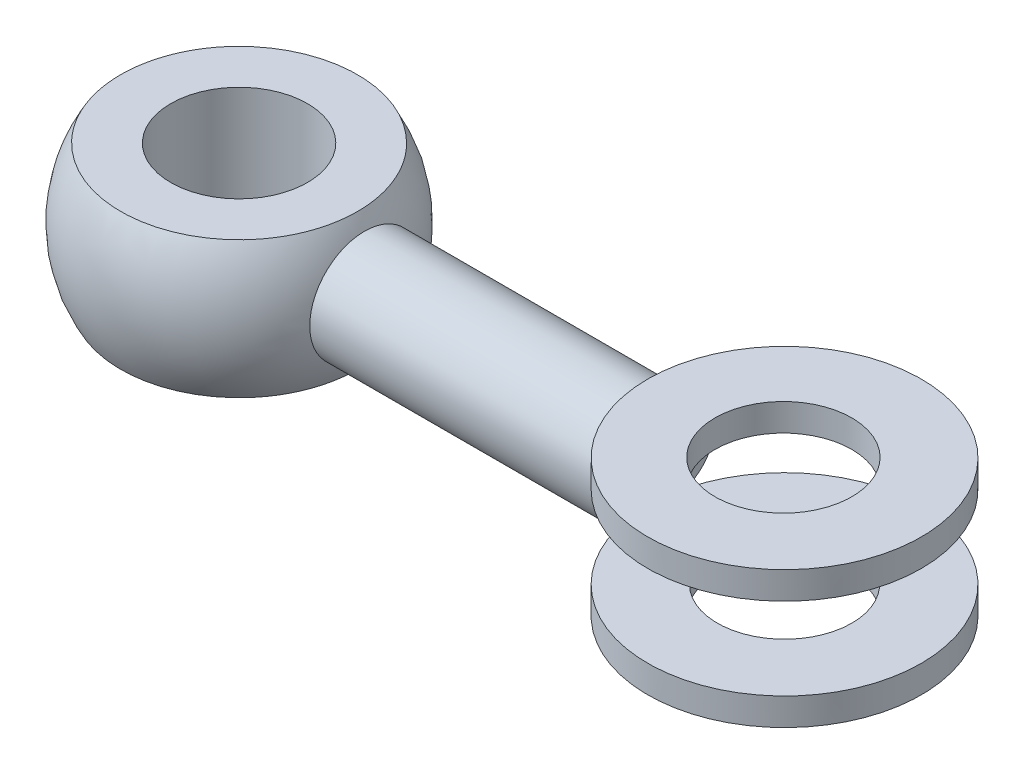
ISO-10303-21;
HEADER;
FILE_DESCRIPTION(('STEP AP214'),'2;1');
FILE_NAME('part.step','',(''),(''),'','','');
FILE_SCHEMA(('AUTOMOTIVE_DESIGN { 1 0 10303 214 1 1 1 1 }'));
ENDSEC;
DATA;
#1=APPLICATION_CONTEXT('core data for automotive mechanical design processes');
#2=APPLICATION_PROTOCOL_DEFINITION('international standard','automotive_design',2000,#1);
#3=PRODUCT_CONTEXT('',#1,'mechanical');
#4=PRODUCT('Part','Part','',(#3));
#5=PRODUCT_RELATED_PRODUCT_CATEGORY('part','',(#4));
#6=PRODUCT_DEFINITION_FORMATION('','',#4);
#7=PRODUCT_DEFINITION_CONTEXT('part definition',#1,'design');
#8=PRODUCT_DEFINITION('design','',#6,#7);
#9=PRODUCT_DEFINITION_SHAPE('','',#8);
#10=(LENGTH_UNIT() NAMED_UNIT(*) SI_UNIT(.MILLI.,.METRE.));
#11=(NAMED_UNIT(*) PLANE_ANGLE_UNIT() SI_UNIT($,.RADIAN.));
#12=(NAMED_UNIT(*) SI_UNIT($,.STERADIAN.) SOLID_ANGLE_UNIT());
#13=UNCERTAINTY_MEASURE_WITH_UNIT(LENGTH_MEASURE(1.E-05),#10,'distance_accuracy_value','');
#14=(GEOMETRIC_REPRESENTATION_CONTEXT(3) GLOBAL_UNCERTAINTY_ASSIGNED_CONTEXT((#13)) GLOBAL_UNIT_ASSIGNED_CONTEXT((#10,
#11,#12)) REPRESENTATION_CONTEXT('',''));
#15=CARTESIAN_POINT('',(0.,0.,0.));
#16=DIRECTION('',(0.,0.,1.));
#17=DIRECTION('',(1.,0.,0.));
#18=AXIS2_PLACEMENT_3D('',#15,#16,#17);
#19=CARTESIAN_POINT('',(6.42740739472541,-2.5,0.));
#20=DIRECTION('',(0.,1.,0.));
#21=DIRECTION('',(-1.,0.,0.));
#22=AXIS2_PLACEMENT_3D('',#19,#20,#21);
#23=CYLINDRICAL_SURFACE('',#22,5.);
#24=CARTESIAN_POINT('',(6.42740739472541,2.5,0.));
#25=DIRECTION('',(0.,1.,0.));
#26=DIRECTION('',(-1.,0.,0.));
#27=AXIS2_PLACEMENT_3D('',#24,#25,#26);
#28=CIRCLE('',#27,5.);
#29=CARTESIAN_POINT('',(1.42740739472541,2.5,0.));
#30=VERTEX_POINT('',#29);
#31=EDGE_CURVE('E243',#30,#30,#28,.T.);
#32=ORIENTED_EDGE('',*,*,#31,.F.);
#33=EDGE_LOOP('',(#32));
#34=FACE_BOUND('',#33,.T.);
#35=CARTESIAN_POINT('',(6.42740739472541,1.5,0.));
#36=DIRECTION('',(0.,-1.,0.));
#37=DIRECTION('',(0.,0.,-1.));
#38=AXIS2_PLACEMENT_3D('',#35,#36,#37);
#39=CIRCLE('',#38,5.);
#40=CARTESIAN_POINT('',(1.60558201422893,1.5,1.32287565553229));
#41=VERTEX_POINT('',#40);
#42=CARTESIAN_POINT('',(1.60558201422893,1.5,-1.32287565553229));
#43=VERTEX_POINT('',#42);
#44=EDGE_CURVE('E98',#41,#43,#39,.F.);
#45=ORIENTED_EDGE('',*,*,#44,.T.);
#46=CARTESIAN_POINT('',(1.83288122185886,0.331165748765926,-1.97239175795386));
#47=CARTESIAN_POINT('',(1.82893263750543,0.386036592019982,-1.96318050221269));
#48=CARTESIAN_POINT('',(1.82402758674765,0.440420842367134,-1.95169241890632));
#49=CARTESIAN_POINT('',(1.81250739932647,0.547851658409661,-1.92430003005419));
#50=CARTESIAN_POINT('',(1.80589314334185,0.600898897604836,-1.90839799851121));
#51=CARTESIAN_POINT('',(1.78384202757039,0.757153398625582,-1.8544041089398));
#52=CARTESIAN_POINT('',(1.7661618452424,0.85791945597766,-1.80994823163201));
#53=CARTESIAN_POINT('',(1.72701358170304,1.05003532469302,-1.70568947825292));
#54=CARTESIAN_POINT('',(1.70555139849076,1.14139945190011,-1.64591043348496));
#55=CARTESIAN_POINT('',(1.66113783118858,1.31309165847897,-1.51248684860598));
#56=CARTESIAN_POINT('',(1.63818510217293,1.39340956124502,-1.43882966900037));
#57=CARTESIAN_POINT('',(1.59204286622503,1.54473339498981,-1.27545539668637));
#58=CARTESIAN_POINT('',(1.56889548140472,1.6151020789403,-1.18513438875745));
#59=CARTESIAN_POINT('',(1.52606650325707,1.7397044381672,-0.99323041930822));
#60=CARTESIAN_POINT('',(1.5063841418371,1.79394169114457,-0.891649961829483));
#61=CARTESIAN_POINT('',(1.47292268957639,1.88378282495693,-0.68135518704803));
#62=CARTESIAN_POINT('',(1.45906398703749,1.91963957651882,-0.572762192378152));
#63=CARTESIAN_POINT('',(1.43845566840791,1.97236843623797,-0.350424487117826));
#64=CARTESIAN_POINT('',(1.4317024232724,1.98925023597262,-0.236682437351122));
#65=CARTESIAN_POINT('',(1.42628804134501,2.00280408481383,-0.0154271565858854));
#66=CARTESIAN_POINT('',(1.42711892832258,2.00074471651273,0.0919976467370722));
#67=CARTESIAN_POINT('',(1.43557369588906,1.97951976775636,0.30485829153367));
#68=CARTESIAN_POINT('',(1.44319702182715,1.9603555840304,0.410294294689108));
#69=CARTESIAN_POINT('',(1.46423624321423,1.9062190869795,0.614207606001767));
#70=CARTESIAN_POINT('',(1.47753886030253,1.87155531746428,0.712779293240618));
#71=CARTESIAN_POINT('',(1.50863571674775,1.78768772417269,0.902751692114103));
#72=CARTESIAN_POINT('',(1.5264307925382,1.73848119244411,0.994151064204514));
#73=CARTESIAN_POINT('',(1.56589726051175,1.62398137723342,1.17238413674218));
#74=CARTESIAN_POINT('',(1.58772266128589,1.55798161169196,1.25872938560521));
#75=CARTESIAN_POINT('',(1.63242062648975,1.41302746282852,1.41953592797625));
#76=CARTESIAN_POINT('',(1.6552939415832,1.33406368484425,1.4939885254366));
#77=CARTESIAN_POINT('',(1.70105395501131,1.16010845766205,1.63317372086297));
#78=CARTESIAN_POINT('',(1.72386738057451,1.06446074390196,1.69711234708075));
#79=CARTESIAN_POINT('',(1.76531275420334,0.863002021029599,1.80786802969631));
#80=CARTESIAN_POINT('',(1.78395219978249,0.757209730521084,1.85471588223527));
#81=CARTESIAN_POINT('',(1.806465622332,0.596416555827244,1.90977862896632));
#82=CARTESIAN_POINT('',(1.81293136369684,0.544190083309624,1.92531359443896));
#83=CARTESIAN_POINT('',(1.82419821994782,0.438520729472062,1.95209268603528));
#84=CARTESIAN_POINT('',(1.82900071014408,0.385078892272526,1.96334035801679));
#85=CARTESIAN_POINT('',(1.83288122185886,0.331165748765926,1.97239175795386));
#86=B_SPLINE_CURVE_WITH_KNOTS('',3,(#46,#47,#48,#49,#50,#51,#52,#53,#54,#55,#56,#57,#58,#59,#60,
#61,#62,#63,#64,#65,#66,#67,#68,#69,#70,#71,#72,#73,#74,#75,#76,#77,#78,#79,#80,#81,#82,#83,#84,
#85),.UNSPECIFIED.,.F.,.F.,(4,2,2,2,2,2,2,2,2,2,2,2,2,2,2,2,2,2,2,4),(0.,0.167214792314317,
0.334343597350645,0.66725831675205,0.999658380343221,1.33236265317764,1.6811386074451,
2.02983715084009,2.37360022246492,2.71718763501425,3.0379400690038,3.35866631368158,
3.67327410910755,3.9879405233981,4.31905648687453,4.65041346876553,5.00062202736801,
5.35019638565966,5.51462860323809,5.67892452854978),.UNSPECIFIED.);
#87=EDGE_CURVE('E182',#43,#41,#86,.T.);
#88=ORIENTED_EDGE('',*,*,#87,.T.);
#89=EDGE_LOOP('',(#45,#88));
#90=FACE_BOUND('',#89,.T.);
#91=ADVANCED_FACE('F46',(#34,#90),#23,.T.);
#92=CARTESIAN_POINT('',(6.38514994154831,-2.5,0.));
#93=DIRECTION('',(0.,1.,0.));
#94=DIRECTION('',(-1.,0.,0.));
#95=AXIS2_PLACEMENT_3D('',#92,#93,#94);
#96=CYLINDRICAL_SURFACE('',#95,2.5);
#97=CARTESIAN_POINT('',(6.38514994154831,1.5,0.));
#98=DIRECTION('',(0.,-1.,0.));
#99=DIRECTION('',(0.,0.,-1.));
#100=AXIS2_PLACEMENT_3D('',#97,#98,#99);
#101=CIRCLE('',#100,2.5);
#102=CARTESIAN_POINT('',(6.38514994154831,1.5,-2.5));
#103=VERTEX_POINT('',#102);
#104=EDGE_CURVE('E123',#103,#103,#101,.F.);
#105=ORIENTED_EDGE('',*,*,#104,.F.);
#106=EDGE_LOOP('',(#105));
#107=FACE_BOUND('',#106,.T.);
#108=CARTESIAN_POINT('',(6.3851499415483,2.5,0.));
#109=DIRECTION('',(0.,1.,0.));
#110=DIRECTION('',(-1.,0.,0.));
#111=AXIS2_PLACEMENT_3D('',#108,#109,#110);
#112=CIRCLE('',#111,2.5);
#113=CARTESIAN_POINT('',(3.8851499415483,2.5,0.));
#114=VERTEX_POINT('',#113);
#115=EDGE_CURVE('E245',#114,#114,#112,.T.);
#116=ORIENTED_EDGE('',*,*,#115,.T.);
#117=EDGE_LOOP('',(#116));
#118=FACE_BOUND('',#117,.T.);
#119=ADVANCED_FACE('F158',(#107,#118),#96,.F.);
#120=CARTESIAN_POINT('',(-13.5102645286488,0.,0.));
#121=DIRECTION('',(1.,0.,0.));
#122=DIRECTION('',(0.,1.,0.));
#123=AXIS2_PLACEMENT_3D('',#120,#121,#122);
#124=SPHERICAL_SURFACE('',#123,5.);
#125=CARTESIAN_POINT('',(-13.5102645286488,-2.5,0.));
#126=DIRECTION('',(0.,1.,0.));
#127=DIRECTION('',(-1.,0.,0.));
#128=AXIS2_PLACEMENT_3D('',#125,#126,#127);
#129=CIRCLE('',#128,4.33012701892219);
#130=CARTESIAN_POINT('',(-17.840391547571,-2.5,0.));
#131=VERTEX_POINT('',#130);
#132=EDGE_CURVE('E56',#131,#131,#129,.F.);
#133=ORIENTED_EDGE('',*,*,#132,.F.);
#134=EDGE_LOOP('',(#133));
#135=FACE_BOUND('',#134,.T.);
#136=CARTESIAN_POINT('',(-8.92768883369292,0.,0.));
#137=DIRECTION('',(1.,0.,0.));
#138=DIRECTION('',(0.,1.,0.));
#139=AXIS2_PLACEMENT_3D('',#136,#137,#138);
#140=CIRCLE('',#139,2.);
#141=CARTESIAN_POINT('',(-8.92768883369292,2.,0.));
#142=VERTEX_POINT('',#141);
#143=EDGE_CURVE('E206',#142,#142,#140,.T.);
#144=ORIENTED_EDGE('',*,*,#143,.F.);
#145=EDGE_LOOP('',(#144));
#146=FACE_BOUND('',#145,.T.);
#147=CARTESIAN_POINT('',(-13.5102645286488,2.5,0.));
#148=DIRECTION('',(0.,1.,0.));
#149=DIRECTION('',(-1.,0.,0.));
#150=AXIS2_PLACEMENT_3D('',#147,#148,#149);
#151=CIRCLE('',#150,4.33012701892219);
#152=CARTESIAN_POINT('',(-17.840391547571,2.5,0.));
#153=VERTEX_POINT('',#152);
#154=EDGE_CURVE('E12',#153,#153,#151,.F.);
#155=ORIENTED_EDGE('',*,*,#154,.T.);
#156=EDGE_LOOP('',(#155));
#157=FACE_BOUND('',#156,.T.);
#158=ADVANCED_FACE('F48',(#135,#146,#157),#124,.T.);
#159=CARTESIAN_POINT('',(13.4897354713512,0.,0.));
#160=DIRECTION('',(1.,0.,0.));
#161=DIRECTION('',(0.,1.,0.));
#162=AXIS2_PLACEMENT_3D('',#159,#160,#161);
#163=CYLINDRICAL_SURFACE('',#162,2.);
#164=DIRECTION('',(1.,0.,0.));
#165=VECTOR('',#164,1.);
#166=CARTESIAN_POINT('',(13.4897354713512,-1.5,-1.3228756555323));
#167=LINE('',#166,#165);
#168=CARTESIAN_POINT('',(1.60558201422893,-1.5,-1.3228756555323));
#169=VERTEX_POINT('',#168);
#170=CARTESIAN_POINT('',(1.56332456105183,-1.5,-1.3228756555323));
#171=VERTEX_POINT('',#170);
#172=EDGE_CURVE('E128',#169,#171,#167,.F.);
#173=ORIENTED_EDGE('',*,*,#172,.F.);
#174=CARTESIAN_POINT('',(1.83288122185886,-0.331165748765929,1.97239175795386));
#175=CARTESIAN_POINT('',(1.82893263750543,-0.386036592019986,1.96318050221269));
#176=CARTESIAN_POINT('',(1.82402758674765,-0.440420842367138,1.95169241890632));
#177=CARTESIAN_POINT('',(1.81250739932646,-0.547851658409665,1.92430003005419));
#178=CARTESIAN_POINT('',(1.80589314334185,-0.600898897604839,1.90839799851121));
#179=CARTESIAN_POINT('',(1.78384202757039,-0.757153398625586,1.8544041089398));
#180=CARTESIAN_POINT('',(1.7661618452424,-0.857919455977663,1.80994823163201));
#181=CARTESIAN_POINT('',(1.72701358170304,-1.05003532469302,1.70568947825292));
#182=CARTESIAN_POINT('',(1.70555139849076,-1.14139945190012,1.64591043348496));
#183=CARTESIAN_POINT('',(1.66113783118858,-1.31309165847897,1.51248684860598));
#184=CARTESIAN_POINT('',(1.63818510217293,-1.39340956124502,1.43882966900037));
#185=CARTESIAN_POINT('',(1.59204286622502,-1.54473339498982,1.27545539668637));
#186=CARTESIAN_POINT('',(1.56889548140472,-1.6151020789403,1.18513438875745));
#187=CARTESIAN_POINT('',(1.52606650325707,-1.7397044381672,0.99323041930822));
#188=CARTESIAN_POINT('',(1.5063841418371,-1.79394169114458,0.891649961829483));
#189=CARTESIAN_POINT('',(1.47292268957639,-1.88378282495694,0.681355187048029));
#190=CARTESIAN_POINT('',(1.45906398703749,-1.91963957651882,0.572762192378151));
#191=CARTESIAN_POINT('',(1.43845566840791,-1.97236843623797,0.350424487117826));
#192=CARTESIAN_POINT('',(1.4317024232724,-1.98925023597262,0.236682437351122));
#193=CARTESIAN_POINT('',(1.42628804134501,-2.00280408481384,0.0154271565858854));
#194=CARTESIAN_POINT('',(1.42711892832258,-2.00074471651274,-0.0919976467370722));
#195=CARTESIAN_POINT('',(1.43557369588906,-1.97951976775637,-0.30485829153367));
#196=CARTESIAN_POINT('',(1.44319702182715,-1.96035558403041,-0.410294294689108));
#197=CARTESIAN_POINT('',(1.46423624321423,-1.9062190869795,-0.614207606001767));
#198=CARTESIAN_POINT('',(1.47753886030253,-1.87155531746429,-0.712779293240618));
#199=CARTESIAN_POINT('',(1.50863571674775,-1.78768772417269,-0.902751692114104));
#200=CARTESIAN_POINT('',(1.5264307925382,-1.73848119244411,-0.994151064204514));
#201=CARTESIAN_POINT('',(1.56589726051175,-1.62398137723343,-1.17238413674218));
#202=CARTESIAN_POINT('',(1.58772266128589,-1.55798161169196,-1.25872938560521));
#203=CARTESIAN_POINT('',(1.63242062648975,-1.41302746282852,-1.41953592797625));
#204=CARTESIAN_POINT('',(1.6552939415832,-1.33406368484425,-1.4939885254366));
#205=CARTESIAN_POINT('',(1.70105395501131,-1.16010845766205,-1.63317372086297));
#206=CARTESIAN_POINT('',(1.72386738057451,-1.06446074390197,-1.69711234708075));
#207=CARTESIAN_POINT('',(1.76531275420334,-0.863002021029603,-1.80786802969631));
#208=CARTESIAN_POINT('',(1.78395219978249,-0.757209730521088,-1.85471588223527));
#209=CARTESIAN_POINT('',(1.806465622332,-0.596416555827247,-1.90977862896632));
#210=CARTESIAN_POINT('',(1.81293136369684,-0.544190083309628,-1.92531359443896));
#211=CARTESIAN_POINT('',(1.82419821994782,-0.438520729472065,-1.95209268603528));
#212=CARTESIAN_POINT('',(1.82900071014408,-0.38507889227253,-1.96334035801679));
#213=CARTESIAN_POINT('',(1.83288122185886,-0.331165748765929,-1.97239175795386));
#214=B_SPLINE_CURVE_WITH_KNOTS('',3,(#174,#175,#176,#177,#178,#179,#180,#181,#182,#183,#184,
#185,#186,#187,#188,#189,#190,#191,#192,#193,#194,#195,#196,#197,#198,#199,#200,#201,#202,#203,
#204,#205,#206,#207,#208,#209,#210,#211,#212,#213),.UNSPECIFIED.,.F.,.F.,(4,2,2,2,2,2,2,2,2,2,2,
2,2,2,2,2,2,2,2,4),(0.,0.167214792314317,0.334343597350645,0.66725831675205,0.999658380343221,
1.33236265317764,1.6811386074451,2.02983715084009,2.37360022246492,2.71718763501425,
3.0379400690038,3.35866631368158,3.67327410910755,3.9879405233981,4.31905648687453,
4.65041346876553,5.00062202736801,5.35019638565966,5.51462860323809,5.67892452854978),.UNSPECIFIED.);
#215=CARTESIAN_POINT('',(1.60558201422893,-1.5,1.3228756555323));
#216=VERTEX_POINT('',#215);
#217=EDGE_CURVE('E175',#216,#169,#214,.T.);
#218=ORIENTED_EDGE('',*,*,#217,.F.);
#219=DIRECTION('',(1.,0.,0.));
#220=VECTOR('',#219,1.);
#221=CARTESIAN_POINT('',(13.4897354713512,-1.5,1.3228756555323));
#222=LINE('',#221,#220);
#223=CARTESIAN_POINT('',(1.56332456105183,-1.5,1.3228756555323));
#224=VERTEX_POINT('',#223);
#225=EDGE_CURVE('E121',#224,#216,#222,.T.);
#226=ORIENTED_EDGE('',*,*,#225,.F.);
#227=CARTESIAN_POINT('',(1.56332456105183,-1.5,1.3228756555323));
#228=CARTESIAN_POINT('',(1.58644702610138,-1.42568406397232,1.4071992684898));
#229=CARTESIAN_POINT('',(1.61022096771197,-1.34427666934854,1.48512549597574));
#230=CARTESIAN_POINT('',(1.65654808267839,-1.1691071528308,1.62661061853871));
#231=CARTESIAN_POINT('',(1.67909754145861,-1.0753101107824,1.6901274721877));
#232=CARTESIAN_POINT('',(1.7203229573375,-0.877477742277934,1.80080644952772));
#233=CARTESIAN_POINT('',(1.73899242872696,-0.773425694930752,1.84794127636311));
#234=CARTESIAN_POINT('',(1.76993978236564,-0.558088970799774,1.92393740467447));
#235=CARTESIAN_POINT('',(1.78222813073349,-0.446816476220015,1.95282864563438));
#236=CARTESIAN_POINT('',(1.79825205619268,-0.226101882351161,1.9901669802762));
#237=CARTESIAN_POINT('',(1.8023888211344,-0.116851908196758,1.99957428871509));
#238=CARTESIAN_POINT('',(1.80274721370447,0.101740137298234,2.00039716549716));
#239=CARTESIAN_POINT('',(1.79896893102049,0.211082207581222,1.99181293770755));
#240=CARTESIAN_POINT('',(1.78443933234535,0.420588169738601,1.95800038379566));
#241=CARTESIAN_POINT('',(1.77407273920587,0.52092983746191,1.93368911347572));
#242=CARTESIAN_POINT('',(1.74797066484869,0.716102062040798,1.87022362030885));
#243=CARTESIAN_POINT('',(1.73223189318909,0.810929199504625,1.83106029899273));
#244=CARTESIAN_POINT('',(1.69629580775911,0.997032311509225,1.73703399951388));
#245=CARTESIAN_POINT('',(1.67593017387527,1.08795821646808,1.68154561607248));
#246=CARTESIAN_POINT('',(1.63337225451148,1.25948141121314,1.5572083507869));
#247=CARTESIAN_POINT('',(1.61118296002937,1.34009508005505,1.48838110385044));
#248=CARTESIAN_POINT('',(1.58050041509472,1.444105810342,1.384301739773));
#249=CARTESIAN_POINT('',(1.57186635099369,1.47254034587891,1.3540177578316));
#250=CARTESIAN_POINT('',(1.56332456105183,1.5,1.3228756555323));
#251=B_SPLINE_CURVE_WITH_KNOTS('',3,(#227,#228,#229,#230,#231,#232,#233,#234,#235,#236,#237,
#238,#239,#240,#241,#242,#243,#244,#245,#246,#247,#248,#249,#250),.UNSPECIFIED.,.F.,.F.,(4,2,2,
2,2,2,2,2,2,2,2,4),(0.,0.343917595759249,0.68882607250092,1.03430653466844,1.37921854642271,
1.70668366253024,2.03414506805748,2.34404950873948,2.65414410651059,2.97814781014448,
3.30163033030913,3.42883076671858),.UNSPECIFIED.);
#252=CARTESIAN_POINT('',(1.56332456105183,1.5,1.32287565553229));
#253=VERTEX_POINT('',#252);
#254=EDGE_CURVE('E109',#224,#253,#251,.T.);
#255=ORIENTED_EDGE('',*,*,#254,.T.);
#256=DIRECTION('',(1.,0.,0.));
#257=VECTOR('',#256,1.);
#258=CARTESIAN_POINT('',(13.4897354713512,1.5,1.32287565553229));
#259=LINE('',#258,#257);
#260=EDGE_CURVE('E91',#253,#41,#259,.T.);
#261=ORIENTED_EDGE('',*,*,#260,.T.);
#262=ORIENTED_EDGE('',*,*,#87,.F.);
#263=DIRECTION('',(1.,0.,0.));
#264=VECTOR('',#263,1.);
#265=CARTESIAN_POINT('',(13.4897354713512,1.5,-1.32287565553229));
#266=LINE('',#265,#264);
#267=CARTESIAN_POINT('',(1.56332456105183,1.5,-1.32287565553229));
#268=VERTEX_POINT('',#267);
#269=EDGE_CURVE('E104',#43,#268,#266,.F.);
#270=ORIENTED_EDGE('',*,*,#269,.T.);
#271=CARTESIAN_POINT('',(1.56332456105183,1.5,-1.32287565553229));
#272=CARTESIAN_POINT('',(1.58644702610137,1.42568406397232,-1.4071992684898));
#273=CARTESIAN_POINT('',(1.61022096771196,1.34427666934854,-1.48512549597574));
#274=CARTESIAN_POINT('',(1.65654808267839,1.1691071528308,-1.62661061853871));
#275=CARTESIAN_POINT('',(1.67909754145861,1.07531011078239,-1.6901274721877));
#276=CARTESIAN_POINT('',(1.7203229573375,0.877477742277933,-1.80080644952772));
#277=CARTESIAN_POINT('',(1.73899242872695,0.77342569493075,-1.84794127636311));
#278=CARTESIAN_POINT('',(1.76993978236563,0.558088970799773,-1.92393740467447));
#279=CARTESIAN_POINT('',(1.78222813073349,0.446816476220013,-1.95282864563438));
#280=CARTESIAN_POINT('',(1.79825205619268,0.226101882351159,-1.9901669802762));
#281=CARTESIAN_POINT('',(1.8023888211344,0.116851908196756,-1.99957428871509));
#282=CARTESIAN_POINT('',(1.80274721370447,-0.101740137298236,-2.00039716549716));
#283=CARTESIAN_POINT('',(1.79896893102049,-0.211082207581224,-1.99181293770755));
#284=CARTESIAN_POINT('',(1.78443933234536,-0.420588169738603,-1.95800038379566));
#285=CARTESIAN_POINT('',(1.77407273920587,-0.520929837461912,-1.93368911347572));
#286=CARTESIAN_POINT('',(1.74797066484869,-0.7161020620408,-1.87022362030885));
#287=CARTESIAN_POINT('',(1.73223189318909,-0.810929199504627,-1.83106029899273));
#288=CARTESIAN_POINT('',(1.69629580775911,-0.997032311509227,-1.73703399951388));
#289=CARTESIAN_POINT('',(1.67593017387527,-1.08795821646808,-1.68154561607248));
#290=CARTESIAN_POINT('',(1.63337225451148,-1.25948141121314,-1.5572083507869));
#291=CARTESIAN_POINT('',(1.61118296002937,-1.34009508005506,-1.48838110385044));
#292=CARTESIAN_POINT('',(1.58050041509472,-1.444105810342,-1.38430173977301));
#293=CARTESIAN_POINT('',(1.57186635099369,-1.47254034587891,-1.3540177578316));
#294=CARTESIAN_POINT('',(1.56332456105183,-1.5,-1.3228756555323));
#295=B_SPLINE_CURVE_WITH_KNOTS('',3,(#271,#272,#273,#274,#275,#276,#277,#278,#279,#280,#281,
#282,#283,#284,#285,#286,#287,#288,#289,#290,#291,#292,#293,#294),.UNSPECIFIED.,.F.,.F.,(4,2,2,
2,2,2,2,2,2,2,2,4),(0.,0.343917595759249,0.68882607250092,1.03430653466844,1.37921854642271,
1.70668366253024,2.03414506805748,2.34404950873948,2.65414410651059,2.97814781014448,
3.30163033030913,3.42883076671858),.UNSPECIFIED.);
#296=EDGE_CURVE('E112',#268,#171,#295,.T.);
#297=ORIENTED_EDGE('',*,*,#296,.T.);
#298=EDGE_LOOP('',(#173,#218,#226,#255,#261,#262,#270,#297));
#299=FACE_BOUND('',#298,.T.);
#300=ORIENTED_EDGE('',*,*,#143,.T.);
#301=EDGE_LOOP('',(#300));
#302=FACE_BOUND('',#301,.T.);
#303=ADVANCED_FACE('F118',(#299,#302),#163,.T.);
#304=CARTESIAN_POINT('',(0.,-2.5,-5.));
#305=DIRECTION('',(0.,1.,0.));
#306=DIRECTION('',(-1.,0.,0.));
#307=AXIS2_PLACEMENT_3D('',#304,#305,#306);
#308=PLANE('',#307);
#309=CARTESIAN_POINT('',(-13.5102645286488,-2.5,0.));
#310=DIRECTION('',(0.,1.,0.));
#311=DIRECTION('',(-1.,0.,0.));
#312=AXIS2_PLACEMENT_3D('',#309,#310,#311);
#313=CIRCLE('',#312,2.5);
#314=CARTESIAN_POINT('',(-16.0102645286488,-2.5,0.));
#315=VERTEX_POINT('',#314);
#316=EDGE_CURVE('E194',#315,#315,#313,.T.);
#317=ORIENTED_EDGE('',*,*,#316,.T.);
#318=EDGE_LOOP('',(#317));
#319=FACE_BOUND('',#318,.T.);
#320=ORIENTED_EDGE('',*,*,#132,.T.);
#321=EDGE_LOOP('',(#320));
#322=FACE_BOUND('',#321,.T.);
#323=ADVANCED_FACE('F215',(#319,#322),#308,.F.);
#324=CARTESIAN_POINT('',(0.,2.5,-5.));
#325=DIRECTION('',(0.,1.,0.));
#326=DIRECTION('',(-1.,0.,0.));
#327=AXIS2_PLACEMENT_3D('',#324,#325,#326);
#328=PLANE('',#327);
#329=CARTESIAN_POINT('',(-13.5102645286488,2.5,0.));
#330=DIRECTION('',(0.,1.,0.));
#331=DIRECTION('',(-1.,0.,0.));
#332=AXIS2_PLACEMENT_3D('',#329,#330,#331);
#333=CIRCLE('',#332,2.5);
#334=CARTESIAN_POINT('',(-16.0102645286488,2.5,0.));
#335=VERTEX_POINT('',#334);
#336=EDGE_CURVE('E189',#335,#335,#333,.T.);
#337=ORIENTED_EDGE('',*,*,#336,.F.);
#338=EDGE_LOOP('',(#337));
#339=FACE_BOUND('',#338,.T.);
#340=ORIENTED_EDGE('',*,*,#154,.F.);
#341=EDGE_LOOP('',(#340));
#342=FACE_BOUND('',#341,.T.);
#343=ADVANCED_FACE('F223',(#339,#342),#328,.T.);
#344=CARTESIAN_POINT('',(-13.5102645286488,-7.5,0.));
#345=DIRECTION('',(0.,1.,0.));
#346=DIRECTION('',(-1.,0.,0.));
#347=AXIS2_PLACEMENT_3D('',#344,#345,#346);
#348=CYLINDRICAL_SURFACE('',#347,2.5);
#349=ORIENTED_EDGE('',*,*,#336,.T.);
#350=EDGE_LOOP('',(#349));
#351=FACE_BOUND('',#350,.T.);
#352=ORIENTED_EDGE('',*,*,#316,.F.);
#353=EDGE_LOOP('',(#352));
#354=FACE_BOUND('',#353,.T.);
#355=ADVANCED_FACE('F170',(#351,#354),#348,.F.);
#356=CARTESIAN_POINT('',(6.42740739472541,-1.5,0.));
#357=DIRECTION('',(0.,-1.,0.));
#358=DIRECTION('',(0.,0.,-1.));
#359=AXIS2_PLACEMENT_3D('',#356,#357,#358);
#360=CIRCLE('',#359,5.);
#361=EDGE_CURVE('E68',#216,#169,#360,.F.);
#362=ORIENTED_EDGE('',*,*,#361,.F.);
#363=ORIENTED_EDGE('',*,*,#217,.T.);
#364=EDGE_LOOP('',(#362,#363));
#365=FACE_BOUND('',#364,.T.);
#366=CARTESIAN_POINT('',(6.42740739472541,-2.5,0.));
#367=DIRECTION('',(0.,1.,0.));
#368=DIRECTION('',(-1.,0.,0.));
#369=AXIS2_PLACEMENT_3D('',#366,#367,#368);
#370=CIRCLE('',#369,5.);
#371=CARTESIAN_POINT('',(1.42740739472541,-2.5,0.));
#372=VERTEX_POINT('',#371);
#373=EDGE_CURVE('E258',#372,#372,#370,.T.);
#374=ORIENTED_EDGE('',*,*,#373,.T.);
#375=EDGE_LOOP('',(#374));
#376=FACE_BOUND('',#375,.T.);
#377=ADVANCED_FACE('F162',(#365,#376),#23,.T.);
#378=CARTESIAN_POINT('',(6.42740739472541,-2.5,0.));
#379=DIRECTION('',(0.,1.,0.));
#380=DIRECTION('',(-1.,0.,0.));
#381=AXIS2_PLACEMENT_3D('',#378,#379,#380);
#382=PLANE('',#381);
#383=CARTESIAN_POINT('',(6.38514994154831,-2.5,0.));
#384=DIRECTION('',(0.,1.,0.));
#385=DIRECTION('',(-1.,0.,0.));
#386=AXIS2_PLACEMENT_3D('',#383,#384,#385);
#387=CIRCLE('',#386,2.5);
#388=CARTESIAN_POINT('',(3.88514994154831,-2.5,0.));
#389=VERTEX_POINT('',#388);
#390=EDGE_CURVE('E264',#389,#389,#387,.T.);
#391=ORIENTED_EDGE('',*,*,#390,.T.);
#392=EDGE_LOOP('',(#391));
#393=FACE_BOUND('',#392,.T.);
#394=ORIENTED_EDGE('',*,*,#373,.F.);
#395=EDGE_LOOP('',(#394));
#396=FACE_BOUND('',#395,.T.);
#397=ADVANCED_FACE('F159',(#393,#396),#382,.F.);
#398=CARTESIAN_POINT('',(6.42740739472541,2.5,0.));
#399=DIRECTION('',(0.,1.,0.));
#400=DIRECTION('',(-1.,0.,0.));
#401=AXIS2_PLACEMENT_3D('',#398,#399,#400);
#402=PLANE('',#401);
#403=ORIENTED_EDGE('',*,*,#115,.F.);
#404=EDGE_LOOP('',(#403));
#405=FACE_BOUND('',#404,.T.);
#406=ORIENTED_EDGE('',*,*,#31,.T.);
#407=EDGE_LOOP('',(#406));
#408=FACE_BOUND('',#407,.T.);
#409=ADVANCED_FACE('F156',(#405,#408),#402,.T.);
#410=ORIENTED_EDGE('',*,*,#390,.F.);
#411=EDGE_LOOP('',(#410));
#412=FACE_BOUND('',#411,.T.);
#413=CARTESIAN_POINT('',(6.38514994154831,-1.75,0.));
#414=DIRECTION('',(0.,-1.,0.));
#415=DIRECTION('',(1.,0.,0.));
#416=AXIS2_PLACEMENT_3D('',#413,#414,#415);
#417=CIRCLE('',#416,2.5);
#418=CARTESIAN_POINT('',(8.8851499415483,-1.74999999999999,0.));
#419=VERTEX_POINT('',#418);
#420=EDGE_CURVE('E115',#419,#419,#417,.F.);
#421=ORIENTED_EDGE('',*,*,#420,.T.);
#422=EDGE_LOOP('',(#421));
#423=FACE_BOUND('',#422,.T.);
#424=ADVANCED_FACE('F153',(#412,#423),#96,.F.);
#425=CARTESIAN_POINT('',(0.,1.5,-5.));
#426=DIRECTION('',(0.,-1.,0.));
#427=DIRECTION('',(0.,0.,-1.));
#428=AXIS2_PLACEMENT_3D('',#425,#426,#427);
#429=PLANE('',#428);
#430=ORIENTED_EDGE('',*,*,#269,.F.);
#431=ORIENTED_EDGE('',*,*,#44,.F.);
#432=ORIENTED_EDGE('',*,*,#260,.F.);
#433=CARTESIAN_POINT('',(6.38514994154831,1.5,0.));
#434=DIRECTION('',(0.,-1.,0.));
#435=DIRECTION('',(0.,0.,-1.));
#436=AXIS2_PLACEMENT_3D('',#433,#434,#435);
#437=CIRCLE('',#436,5.);
#438=EDGE_CURVE('E96',#253,#268,#437,.T.);
#439=ORIENTED_EDGE('',*,*,#438,.T.);
#440=EDGE_LOOP('',(#430,#431,#432,#439));
#441=FACE_BOUND('',#440,.T.);
#442=ORIENTED_EDGE('',*,*,#104,.T.);
#443=EDGE_LOOP('',(#442));
#444=FACE_BOUND('',#443,.T.);
#445=ADVANCED_FACE('F94',(#441,#444),#429,.T.);
#446=CARTESIAN_POINT('',(6.38514994154831,-1.5,0.));
#447=DIRECTION('',(0.,1.,0.));
#448=DIRECTION('',(0.,0.,1.));
#449=AXIS2_PLACEMENT_3D('',#446,#447,#448);
#450=CYLINDRICAL_SURFACE('',#449,5.);
#451=CARTESIAN_POINT('',(6.38514994154831,-1.5,0.));
#452=DIRECTION('',(0.,-1.,0.));
#453=DIRECTION('',(0.,0.,-1.));
#454=AXIS2_PLACEMENT_3D('',#451,#452,#453);
#455=CIRCLE('',#454,5.);
#456=EDGE_CURVE('E114',#224,#171,#455,.T.);
#457=ORIENTED_EDGE('',*,*,#456,.T.);
#458=ORIENTED_EDGE('',*,*,#296,.F.);
#459=ORIENTED_EDGE('',*,*,#438,.F.);
#460=ORIENTED_EDGE('',*,*,#254,.F.);
#461=EDGE_LOOP('',(#457,#458,#459,#460));
#462=FACE_BOUND('',#461,.T.);
#463=ADVANCED_FACE('F108',(#462),#450,.F.);
#464=CARTESIAN_POINT('',(6.38514994154831,-1.5,0.));
#465=DIRECTION('',(0.,-1.,0.));
#466=DIRECTION('',(0.,0.,-1.));
#467=AXIS2_PLACEMENT_3D('',#464,#465,#466);
#468=PLANE('',#467);
#469=CARTESIAN_POINT('',(6.42740739472541,-1.5,0.));
#470=DIRECTION('',(0.,-1.,0.));
#471=DIRECTION('',(0.,0.,-1.));
#472=AXIS2_PLACEMENT_3D('',#469,#470,#471);
#473=CIRCLE('',#472,2.4577425468229);
#474=CARTESIAN_POINT('',(6.42740739472541,-1.5,-2.4577425468229));
#475=VERTEX_POINT('',#474);
#476=EDGE_CURVE('E277',#475,#475,#473,.T.);
#477=ORIENTED_EDGE('',*,*,#476,.T.);
#478=EDGE_LOOP('',(#477));
#479=FACE_BOUND('',#478,.T.);
#480=ORIENTED_EDGE('',*,*,#172,.T.);
#481=ORIENTED_EDGE('',*,*,#456,.F.);
#482=ORIENTED_EDGE('',*,*,#225,.T.);
#483=ORIENTED_EDGE('',*,*,#361,.T.);
#484=EDGE_LOOP('',(#480,#481,#482,#483));
#485=FACE_BOUND('',#484,.T.);
#486=ADVANCED_FACE('F148',(#479,#485),#468,.F.);
#487=CARTESIAN_POINT('',(6.42740739472541,-1.75,0.));
#488=DIRECTION('',(0.,-1.,0.));
#489=DIRECTION('',(1.,0.,0.));
#490=AXIS2_PLACEMENT_3D('',#487,#488,#489);
#491=PLANE('',#490);
#492=ORIENTED_EDGE('',*,*,#420,.F.);
#493=CARTESIAN_POINT('',(6.42740739472541,-1.75,0.));
#494=DIRECTION('',(0.,-1.,0.));
#495=DIRECTION('',(1.,0.,0.));
#496=AXIS2_PLACEMENT_3D('',#493,#494,#495);
#497=CIRCLE('',#496,2.4577425468229);
#498=EDGE_CURVE('E50',#419,#419,#497,.T.);
#499=ORIENTED_EDGE('',*,*,#498,.F.);
#500=EDGE_LOOP('',(#492,#499));
#501=FACE_BOUND('',#500,.T.);
#502=ADVANCED_FACE('F288',(#501),#491,.T.);
#503=CARTESIAN_POINT('',(6.42740739472541,2.5,0.));
#504=DIRECTION('',(0.,-1.,0.));
#505=DIRECTION('',(1.,0.,0.));
#506=AXIS2_PLACEMENT_3D('',#503,#504,#505);
#507=CYLINDRICAL_SURFACE('',#506,2.4577425468229);
#508=ORIENTED_EDGE('',*,*,#498,.T.);
#509=EDGE_LOOP('',(#508));
#510=FACE_BOUND('',#509,.T.);
#511=ORIENTED_EDGE('',*,*,#476,.F.);
#512=EDGE_LOOP('',(#511));
#513=FACE_BOUND('',#512,.T.);
#514=ADVANCED_FACE('F286',(#510,#513),#507,.F.);
#515=CLOSED_SHELL('',(#91,#119,#158,#303,#323,#343,#355,#377,#397,#409,#424,#445,#463,#486,#502,#514));
#516=MANIFOLD_SOLID_BREP('B2',#515);
#517=ADVANCED_BREP_SHAPE_REPRESENTATION('',(#18,#516),#14);
#518=SHAPE_DEFINITION_REPRESENTATION(#9,#517);
ENDSEC;
END-ISO-10303-21;
